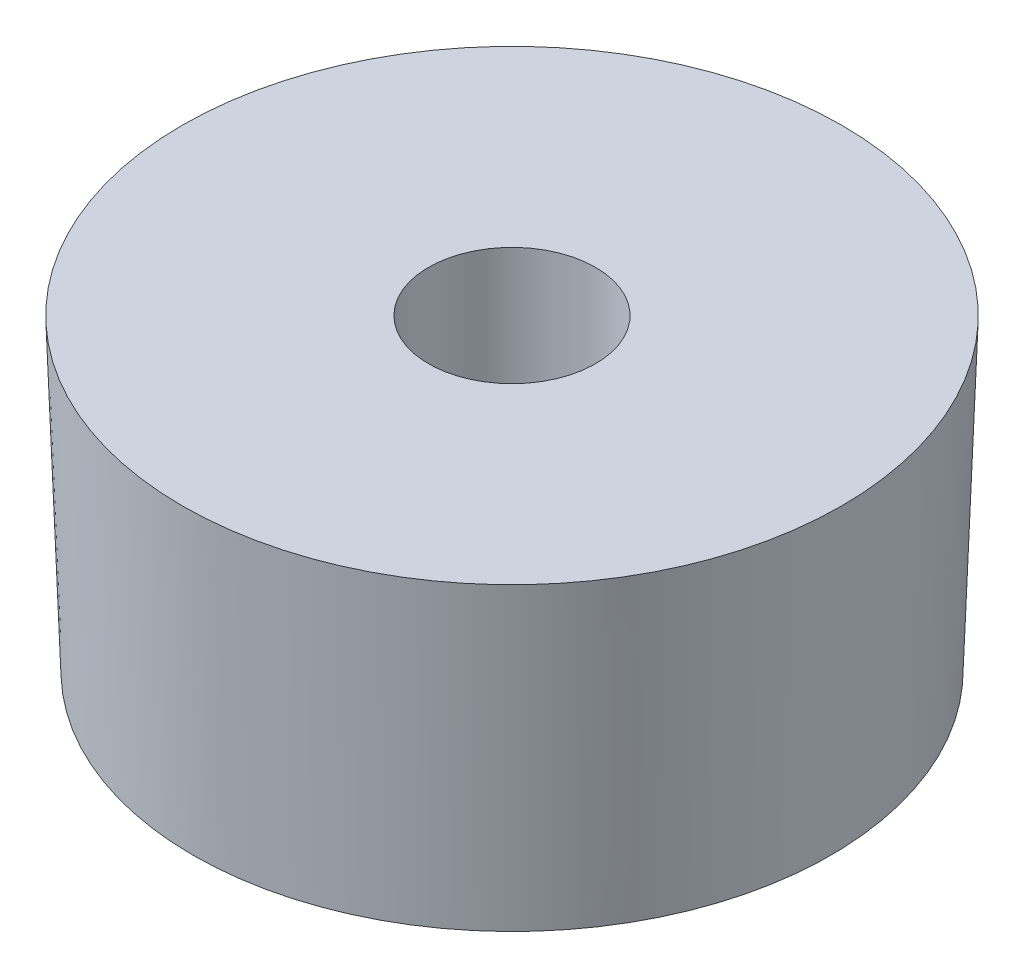
ISO-10303-21;
HEADER;
FILE_DESCRIPTION(('STEP AP214'),'2;1');
FILE_NAME('part.step','',(''),(''),'','','');
FILE_SCHEMA(('AUTOMOTIVE_DESIGN { 1 0 10303 214 1 1 1 1 }'));
ENDSEC;
DATA;
#1=APPLICATION_CONTEXT('core data for automotive mechanical design processes');
#2=APPLICATION_PROTOCOL_DEFINITION('international standard','automotive_design',2000,#1);
#3=PRODUCT_CONTEXT('',#1,'mechanical');
#4=PRODUCT('Part','Part','',(#3));
#5=PRODUCT_RELATED_PRODUCT_CATEGORY('part','',(#4));
#6=PRODUCT_DEFINITION_FORMATION('','',#4);
#7=PRODUCT_DEFINITION_CONTEXT('part definition',#1,'design');
#8=PRODUCT_DEFINITION('design','',#6,#7);
#9=PRODUCT_DEFINITION_SHAPE('','',#8);
#10=(LENGTH_UNIT() NAMED_UNIT(*) SI_UNIT(.MILLI.,.METRE.));
#11=(NAMED_UNIT(*) PLANE_ANGLE_UNIT() SI_UNIT($,.RADIAN.));
#12=(NAMED_UNIT(*) SI_UNIT($,.STERADIAN.) SOLID_ANGLE_UNIT());
#13=UNCERTAINTY_MEASURE_WITH_UNIT(LENGTH_MEASURE(1.E-05),#10,'distance_accuracy_value','');
#14=(GEOMETRIC_REPRESENTATION_CONTEXT(3) GLOBAL_UNCERTAINTY_ASSIGNED_CONTEXT((#13)) GLOBAL_UNIT_ASSIGNED_CONTEXT((#10,
#11,#12)) REPRESENTATION_CONTEXT('',''));
#15=CARTESIAN_POINT('',(0.,0.,0.));
#16=DIRECTION('',(0.,0.,1.));
#17=DIRECTION('',(1.,0.,0.));
#18=AXIS2_PLACEMENT_3D('',#15,#16,#17);
#19=CARTESIAN_POINT('',(0.,0.,0.));
#20=DIRECTION('',(0.,1.,0.));
#21=DIRECTION('',(0.,0.,1.));
#22=AXIS2_PLACEMENT_3D('',#19,#20,#21);
#23=PLANE('',#22);
#24=CARTESIAN_POINT('',(0.,0.,0.));
#25=DIRECTION('',(0.,1.,0.));
#26=DIRECTION('',(0.,0.,1.));
#27=AXIS2_PLACEMENT_3D('',#24,#25,#26);
#28=CIRCLE('',#27,7.25);
#29=CARTESIAN_POINT('',(0.,0.,7.25));
#30=VERTEX_POINT('',#29);
#31=EDGE_CURVE('E49',#30,#30,#28,.T.);
#32=ORIENTED_EDGE('',*,*,#31,.F.);
#33=EDGE_LOOP('',(#32));
#34=FACE_BOUND('',#33,.T.);
#35=CARTESIAN_POINT('',(0.,0.,0.));
#36=DIRECTION('',(0.,-1.,0.));
#37=DIRECTION('',(0.,0.,-1.));
#38=AXIS2_PLACEMENT_3D('',#35,#36,#37);
#39=CIRCLE('',#38,3.96875);
#40=CARTESIAN_POINT('',(0.,0.,-3.96875));
#41=VERTEX_POINT('',#40);
#42=EDGE_CURVE('E70',#41,#41,#39,.T.);
#43=ORIENTED_EDGE('',*,*,#42,.F.);
#44=EDGE_LOOP('',(#43));
#45=FACE_BOUND('',#44,.T.);
#46=ADVANCED_FACE('F41',(#34,#45),#23,.F.);
#47=CARTESIAN_POINT('',(0.,0.,0.));
#48=DIRECTION('',(0.,1.,0.));
#49=DIRECTION('',(0.,0.,1.));
#50=AXIS2_PLACEMENT_3D('',#47,#48,#49);
#51=CONICAL_SURFACE('',#50,7.25,0.0349065850398866);
#52=CARTESIAN_POINT('',(0.,7.,0.));
#53=DIRECTION('',(0.,1.,0.));
#54=DIRECTION('',(0.,0.,1.));
#55=AXIS2_PLACEMENT_3D('',#52,#53,#54);
#56=CIRCLE('',#55,7.49444538644224);
#57=CARTESIAN_POINT('',(0.,7.,7.49444538644224));
#58=VERTEX_POINT('',#57);
#59=EDGE_CURVE('E10',#58,#58,#56,.T.);
#60=ORIENTED_EDGE('',*,*,#59,.F.);
#61=EDGE_LOOP('',(#60));
#62=FACE_BOUND('',#61,.T.);
#63=ORIENTED_EDGE('',*,*,#31,.T.);
#64=EDGE_LOOP('',(#63));
#65=FACE_BOUND('',#64,.T.);
#66=ADVANCED_FACE('F43',(#62,#65),#51,.T.);
#67=CARTESIAN_POINT('',(0.,7.,0.));
#68=DIRECTION('',(0.,1.,0.));
#69=DIRECTION('',(0.,0.,1.));
#70=AXIS2_PLACEMENT_3D('',#67,#68,#69);
#71=PLANE('',#70);
#72=CARTESIAN_POINT('',(0.,7.,0.));
#73=DIRECTION('',(0.,-1.,0.));
#74=DIRECTION('',(0.,0.,-1.));
#75=AXIS2_PLACEMENT_3D('',#72,#73,#74);
#76=CIRCLE('',#75,1.89865);
#77=CARTESIAN_POINT('',(0.,7.,-1.89865));
#78=VERTEX_POINT('',#77);
#79=EDGE_CURVE('E56',#78,#78,#76,.T.);
#80=ORIENTED_EDGE('',*,*,#79,.T.);
#81=EDGE_LOOP('',(#80));
#82=FACE_BOUND('',#81,.T.);
#83=ORIENTED_EDGE('',*,*,#59,.T.);
#84=EDGE_LOOP('',(#83));
#85=FACE_BOUND('',#84,.T.);
#86=ADVANCED_FACE('F82',(#82,#85),#71,.T.);
#87=CARTESIAN_POINT('',(0.,0.,0.));
#88=DIRECTION('',(0.,-1.,0.));
#89=DIRECTION('',(0.,0.,-1.));
#90=AXIS2_PLACEMENT_3D('',#87,#88,#89);
#91=CYLINDRICAL_SURFACE('',#90,1.89865);
#92=ORIENTED_EDGE('',*,*,#79,.F.);
#93=EDGE_LOOP('',(#92));
#94=FACE_BOUND('',#93,.T.);
#95=CARTESIAN_POINT('',(0.,2.2098,0.));
#96=DIRECTION('',(0.,-1.,0.));
#97=DIRECTION('',(0.,0.,-1.));
#98=AXIS2_PLACEMENT_3D('',#95,#96,#97);
#99=CIRCLE('',#98,1.89865);
#100=CARTESIAN_POINT('',(0.,2.2098,-1.89865));
#101=VERTEX_POINT('',#100);
#102=EDGE_CURVE('E61',#101,#101,#99,.T.);
#103=ORIENTED_EDGE('',*,*,#102,.T.);
#104=EDGE_LOOP('',(#103));
#105=FACE_BOUND('',#104,.T.);
#106=ADVANCED_FACE('F86',(#94,#105),#91,.F.);
#107=CARTESIAN_POINT('',(1.89865,2.2098,0.));
#108=DIRECTION('',(0.,1.,0.));
#109=DIRECTION('',(0.,0.,1.));
#110=AXIS2_PLACEMENT_3D('',#107,#108,#109);
#111=PLANE('',#110);
#112=ORIENTED_EDGE('',*,*,#102,.F.);
#113=EDGE_LOOP('',(#112));
#114=FACE_BOUND('',#113,.T.);
#115=CARTESIAN_POINT('',(0.,2.2098,0.));
#116=DIRECTION('',(0.,-1.,0.));
#117=DIRECTION('',(0.,0.,-1.));
#118=AXIS2_PLACEMENT_3D('',#115,#116,#117);
#119=CIRCLE('',#118,3.96875);
#120=CARTESIAN_POINT('',(0.,2.2098,-3.96875));
#121=VERTEX_POINT('',#120);
#122=EDGE_CURVE('E67',#121,#121,#119,.T.);
#123=ORIENTED_EDGE('',*,*,#122,.T.);
#124=EDGE_LOOP('',(#123));
#125=FACE_BOUND('',#124,.T.);
#126=ADVANCED_FACE('F90',(#114,#125),#111,.F.);
#127=CARTESIAN_POINT('',(0.,0.,0.));
#128=DIRECTION('',(0.,-1.,0.));
#129=DIRECTION('',(0.,0.,-1.));
#130=AXIS2_PLACEMENT_3D('',#127,#128,#129);
#131=CYLINDRICAL_SURFACE('',#130,3.96875);
#132=ORIENTED_EDGE('',*,*,#122,.F.);
#133=EDGE_LOOP('',(#132));
#134=FACE_BOUND('',#133,.T.);
#135=ORIENTED_EDGE('',*,*,#42,.T.);
#136=EDGE_LOOP('',(#135));
#137=FACE_BOUND('',#136,.T.);
#138=ADVANCED_FACE('F74',(#134,#137),#131,.F.);
#139=CLOSED_SHELL('',(#46,#66,#86,#106,#126,#138));
#140=MANIFOLD_SOLID_BREP('B2',#139);
#141=ADVANCED_BREP_SHAPE_REPRESENTATION('',(#18,#140),#14);
#142=SHAPE_DEFINITION_REPRESENTATION(#9,#141);
ENDSEC;
END-ISO-10303-21;
